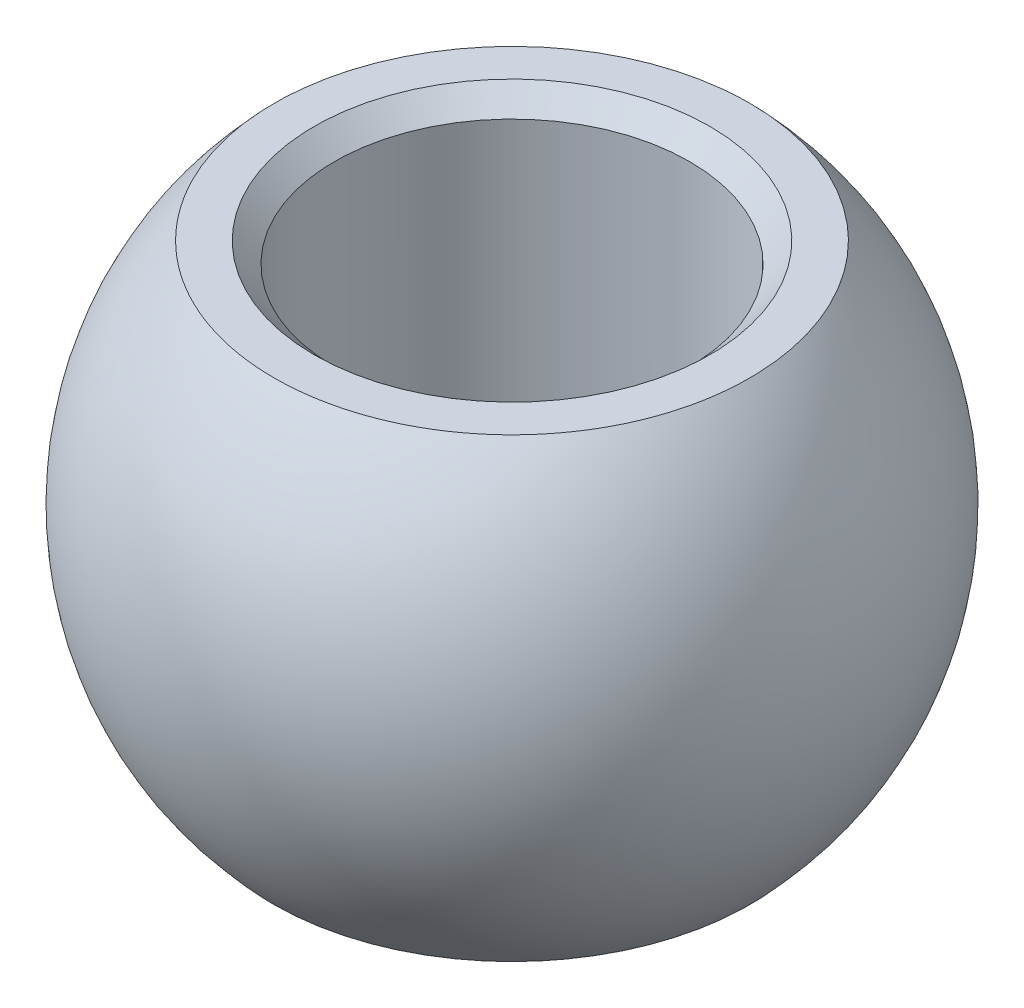
ISO-10303-21;
HEADER;
FILE_DESCRIPTION(('STEP AP214'),'2;1');
FILE_NAME('part.step','',(''),(''),'','','');
FILE_SCHEMA(('AUTOMOTIVE_DESIGN { 1 0 10303 214 1 1 1 1 }'));
ENDSEC;
DATA;
#1=APPLICATION_CONTEXT('core data for automotive mechanical design processes');
#2=APPLICATION_PROTOCOL_DEFINITION('international standard','automotive_design',2000,#1);
#3=PRODUCT_CONTEXT('',#1,'mechanical');
#4=PRODUCT('Part','Part','',(#3));
#5=PRODUCT_RELATED_PRODUCT_CATEGORY('part','',(#4));
#6=PRODUCT_DEFINITION_FORMATION('','',#4);
#7=PRODUCT_DEFINITION_CONTEXT('part definition',#1,'design');
#8=PRODUCT_DEFINITION('design','',#6,#7);
#9=PRODUCT_DEFINITION_SHAPE('','',#8);
#10=(LENGTH_UNIT() NAMED_UNIT(*) SI_UNIT(.MILLI.,.METRE.));
#11=(NAMED_UNIT(*) PLANE_ANGLE_UNIT() SI_UNIT($,.RADIAN.));
#12=(NAMED_UNIT(*) SI_UNIT($,.STERADIAN.) SOLID_ANGLE_UNIT());
#13=UNCERTAINTY_MEASURE_WITH_UNIT(LENGTH_MEASURE(1.E-05),#10,'distance_accuracy_value','');
#14=(GEOMETRIC_REPRESENTATION_CONTEXT(3) GLOBAL_UNCERTAINTY_ASSIGNED_CONTEXT((#13)) GLOBAL_UNIT_ASSIGNED_CONTEXT((#10,
#11,#12)) REPRESENTATION_CONTEXT('',''));
#15=CARTESIAN_POINT('',(0.,0.,0.));
#16=DIRECTION('',(0.,0.,1.));
#17=DIRECTION('',(1.,0.,0.));
#18=AXIS2_PLACEMENT_3D('',#15,#16,#17);
#19=CARTESIAN_POINT('',(0.,0.,61.9252));
#20=DIRECTION('',(0.,1.,0.));
#21=DIRECTION('',(0.,0.,1.));
#22=AXIS2_PLACEMENT_3D('',#19,#20,#21);
#23=CYLINDRICAL_SURFACE('',#22,5.55625);
#24=CARTESIAN_POINT('',(0.,-6.50239999993119,61.9252));
#25=DIRECTION('',(0.,-1.,0.));
#26=DIRECTION('',(0.,0.,-1.));
#27=AXIS2_PLACEMENT_3D('',#24,#25,#26);
#28=CIRCLE('',#27,5.55625000002179);
#29=CARTESIAN_POINT('',(0.,-6.50239999993119,56.3689499999782));
#30=VERTEX_POINT('',#29);
#31=EDGE_CURVE('E34',#30,#30,#28,.T.);
#32=ORIENTED_EDGE('',*,*,#31,.T.);
#33=EDGE_LOOP('',(#32));
#34=FACE_BOUND('',#33,.T.);
#35=CARTESIAN_POINT('',(0.,6.50239999993119,61.9252));
#36=DIRECTION('',(0.,1.,0.));
#37=DIRECTION('',(0.,0.,-1.));
#38=AXIS2_PLACEMENT_3D('',#35,#36,#37);
#39=CIRCLE('',#38,5.55625000002179);
#40=CARTESIAN_POINT('',(0.,6.50239999993119,56.3689499999782));
#41=VERTEX_POINT('',#40);
#42=EDGE_CURVE('E72',#41,#41,#39,.T.);
#43=ORIENTED_EDGE('',*,*,#42,.T.);
#44=EDGE_LOOP('',(#43));
#45=FACE_BOUND('',#44,.T.);
#46=ADVANCED_FACE('F14',(#34,#45),#23,.F.);
#47=CARTESIAN_POINT('',(0.,-7.13739999986274,61.9252));
#48=DIRECTION('',(0.,-1.,0.));
#49=DIRECTION('',(1.,0.,0.));
#50=AXIS2_PLACEMENT_3D('',#47,#48,#49);
#51=CONICAL_SURFACE('',#50,6.19124999989649,0.785398163397448);
#52=ORIENTED_EDGE('',*,*,#31,.F.);
#53=EDGE_LOOP('',(#52));
#54=FACE_BOUND('',#53,.T.);
#55=CARTESIAN_POINT('',(0.,-7.13739999991958,61.9252));
#56=DIRECTION('',(0.,-1.,0.));
#57=DIRECTION('',(1.,0.,0.));
#58=AXIS2_PLACEMENT_3D('',#55,#56,#57);
#59=CIRCLE('',#58,6.19124999995334);
#60=CARTESIAN_POINT('',(6.19124999995334,-7.13739999991958,61.9252));
#61=VERTEX_POINT('',#60);
#62=EDGE_CURVE('E20',#61,#61,#59,.T.);
#63=ORIENTED_EDGE('',*,*,#62,.T.);
#64=EDGE_LOOP('',(#63));
#65=FACE_BOUND('',#64,.T.);
#66=ADVANCED_FACE('F51',(#54,#65),#51,.F.);
#67=CARTESIAN_POINT('',(0.,7.13739999986274,61.9252));
#68=DIRECTION('',(0.,1.,0.));
#69=DIRECTION('',(0.,0.,1.));
#70=AXIS2_PLACEMENT_3D('',#67,#68,#69);
#71=CONICAL_SURFACE('',#70,6.19124999989649,0.785398163397448);
#72=ORIENTED_EDGE('',*,*,#42,.F.);
#73=EDGE_LOOP('',(#72));
#74=FACE_BOUND('',#73,.T.);
#75=CARTESIAN_POINT('',(0.,7.13739999991958,61.9252));
#76=DIRECTION('',(0.,1.,0.));
#77=DIRECTION('',(0.,0.,1.));
#78=AXIS2_PLACEMENT_3D('',#75,#76,#77);
#79=CIRCLE('',#78,6.19124999995334);
#80=CARTESIAN_POINT('',(0.,7.13739999991958,68.1164499999533));
#81=VERTEX_POINT('',#80);
#82=EDGE_CURVE('E29',#81,#81,#79,.T.);
#83=ORIENTED_EDGE('',*,*,#82,.T.);
#84=EDGE_LOOP('',(#83));
#85=FACE_BOUND('',#84,.T.);
#86=ADVANCED_FACE('F47',(#74,#85),#71,.F.);
#87=CARTESIAN_POINT('',(0.,-7.1374,61.9252));
#88=DIRECTION('',(0.,1.,0.));
#89=DIRECTION('',(0.,0.,1.));
#90=AXIS2_PLACEMENT_3D('',#87,#88,#89);
#91=PLANE('',#90);
#92=CARTESIAN_POINT('',(0.,-7.1374,69.368526877143));
#93=CARTESIAN_POINT('',(0.209122739253839,-7.1374,69.3685283780649));
#94=CARTESIAN_POINT('',(0.418220852599612,-7.1374,69.3597101963158));
#95=CARTESIAN_POINT('',(0.835000656901919,-7.1374,69.3244990193713));
#96=CARTESIAN_POINT('',(1.04268196070642,-7.1374,69.298101400655));
#97=CARTESIAN_POINT('',(1.45526472713055,-7.1374,69.2278811222578));
#98=CARTESIAN_POINT('',(1.66016354577062,-7.1374,69.1840429453168));
#99=CARTESIAN_POINT('',(2.06561280096337,-7.1374,69.0792349984351));
#100=CARTESIAN_POINT('',(2.26616161974078,-7.13739999999999,69.0182589686894));
#101=CARTESIAN_POINT('',(2.66123701657341,-7.13739999999999,68.8796747190864));
#102=CARTESIAN_POINT('',(2.85576854014373,-7.1374,68.8020805967283));
#103=CARTESIAN_POINT('',(3.23767444667339,-7.1374,68.6307496929814));
#104=CARTESIAN_POINT('',(3.42504616445478,-7.1374,68.5370069705722));
#105=CARTESIAN_POINT('',(3.79114275050494,-7.1374,68.3341102735748));
#106=CARTESIAN_POINT('',(3.96987139469037,-7.1374,68.2249631119289));
#107=CARTESIAN_POINT('',(4.31750265674955,-7.1374,67.9920003289327));
#108=CARTESIAN_POINT('',(4.48640512247445,-7.13739999999999,67.8681844805419));
#109=CARTESIAN_POINT('',(4.81319441998464,-7.13739999999999,67.6067545791463));
#110=CARTESIAN_POINT('',(4.97108031067617,-7.1374,67.4691393497671));
#111=CARTESIAN_POINT('',(5.27470181314894,-7.1374,67.1810943837631));
#112=CARTESIAN_POINT('',(5.42043713895087,-7.1374,67.0306643456936));
#113=CARTESIAN_POINT('',(5.69869699928873,-7.1374,66.718084810441));
#114=CARTESIAN_POINT('',(5.83122345337967,-7.1374,66.5559370220438));
#115=CARTESIAN_POINT('',(6.08219130069356,-7.1374,66.2209969584441));
#116=CARTESIAN_POINT('',(6.20062780102495,-7.1374,66.0482010169901));
#117=CARTESIAN_POINT('',(6.42247830360987,-7.1374,65.6933112162302));
#118=CARTESIAN_POINT('',(6.5258979413687,-7.1374,65.5112208797635));
#119=CARTESIAN_POINT('',(6.71706815888448,-7.1374,65.1389077086514));
#120=CARTESIAN_POINT('',(6.804812939462,-7.1374,64.9486818962746));
#121=CARTESIAN_POINT('',(6.96394696075429,-7.1374,64.5615512118508));
#122=CARTESIAN_POINT('',(7.03533937644247,-7.1374,64.3646476448939));
#123=CARTESIAN_POINT('',(7.16128395849873,-7.1374,63.9655230960196));
#124=CARTESIAN_POINT('',(7.2158358628712,-7.1374,63.7633020314284));
#125=CARTESIAN_POINT('',(7.30770926145876,-7.1374,63.3549867398679));
#126=CARTESIAN_POINT('',(7.34503105831934,-7.1374,63.1488925809955));
#127=CARTESIAN_POINT('',(7.40218099595225,-7.1374,62.7342879352277));
#128=CARTESIAN_POINT('',(7.42200872744656,-7.1374,62.5257773919161));
#129=CARTESIAN_POINT('',(7.4440260311025,-7.1374,62.1078662222422));
#130=CARTESIAN_POINT('',(7.44621889358321,-7.1374,61.8984657692149));
#131=CARTESIAN_POINT('',(7.43295720234929,-7.1374,61.4801517453058));
#132=CARTESIAN_POINT('',(7.41749653831505,-7.1374,61.2712383680989));
#133=CARTESIAN_POINT('',(7.3690365010343,-7.1374,60.8555315434627));
#134=CARTESIAN_POINT('',(7.33604339495872,-7.1374,60.6487373654084));
#135=CARTESIAN_POINT('',(7.25274141709033,-7.1374,60.238586915631));
#136=CARTESIAN_POINT('',(7.20242615660662,-7.1374,60.0352319414137));
#137=CARTESIAN_POINT('',(7.08485157972004,-7.1374,59.633523060902));
#138=CARTESIAN_POINT('',(7.01759550583887,-7.1374,59.4351682055534));
#139=CARTESIAN_POINT('',(6.86661151984081,-7.1374,59.0448262908173));
#140=CARTESIAN_POINT('',(6.78288335148269,-7.13740000000001,58.8528393305436));
#141=CARTESIAN_POINT('',(6.59955283994053,-7.13740000000001,58.4766050966502));
#142=CARTESIAN_POINT('',(6.49995081111706,-7.1374,58.2923576698507));
#143=CARTESIAN_POINT('',(6.28557730517904,-7.1374,57.9329042469257));
#144=CARTESIAN_POINT('',(6.17080547324815,-7.1374,57.7576984624144));
#145=CARTESIAN_POINT('',(5.92693148140618,-7.1374,57.4176095739012));
#146=CARTESIAN_POINT('',(5.79783197919536,-7.1374,57.2527245643004));
#147=CARTESIAN_POINT('',(5.5261605928008,-7.1374,56.9343606709754));
#148=CARTESIAN_POINT('',(5.38358405954723,-7.13740000000001,56.7808857561624));
#149=CARTESIAN_POINT('',(5.08604553951807,-7.13740000000001,56.4865413117663));
#150=CARTESIAN_POINT('',(4.93108799828014,-7.1374,56.3456672958577));
#151=CARTESIAN_POINT('',(4.60985257138509,-7.1374,56.0774446135473));
#152=CARTESIAN_POINT('',(4.44357052717066,-7.1374,55.9501009601601));
#153=CARTESIAN_POINT('',(3.92958368140964,-7.13740000000001,55.5898955323625));
#154=CARTESIAN_POINT('',(3.56641448794115,-7.13740000000002,55.3785396655555));
#155=CARTESIAN_POINT('',(2.80993865198825,-7.13740000000002,55.0199243906894));
#156=CARTESIAN_POINT('',(2.4166320107942,-7.1374,54.8726649798859));
#157=CARTESIAN_POINT('',(1.6108306225348,-7.1374,54.6462310956424));
#158=CARTESIAN_POINT('',(1.19833587633387,-7.13740000000001,54.5670566191352));
#159=CARTESIAN_POINT('',(0.365908515599231,-7.13740000000001,54.4791007632127));
#160=CARTESIAN_POINT('',(-0.0540240989344792,-7.1374,54.4703193837973));
#161=CARTESIAN_POINT('',(-0.889354048369798,-7.1374,54.5233482139819));
#162=CARTESIAN_POINT('',(-1.30475138306709,-7.13740000000001,54.585158426762));
#163=CARTESIAN_POINT('',(-2.11946966345171,-7.13740000000001,54.7777583472061));
#164=CARTESIAN_POINT('',(-2.51879060845072,-7.1374,54.9085480578235));
#165=CARTESIAN_POINT('',(-3.0967069491697,-7.1374,55.153380921141));
#166=CARTESIAN_POINT('',(-3.28593071572193,-7.1374,55.2431611553682));
#167=CARTESIAN_POINT('',(-3.6561285160143,-7.1374,55.4383256896898));
#168=CARTESIAN_POINT('',(-3.83710556880846,-7.1374,55.5437042183693));
#169=CARTESIAN_POINT('',(-4.18958894640044,-7.1374,55.7693661145088));
#170=CARTESIAN_POINT('',(-4.36109186142807,-7.1374,55.8896547983013));
#171=CARTESIAN_POINT('',(-4.69329914967475,-7.1374,56.1442117239473));
#172=CARTESIAN_POINT('',(-4.85400723983645,-7.1374,56.2784751129211));
#173=CARTESIAN_POINT('',(-5.16357128337301,-7.1374,56.5600866874992));
#174=CARTESIAN_POINT('',(-5.312425035988,-7.1374,56.7074372920566));
#175=CARTESIAN_POINT('',(-5.59718703773549,-7.1374,57.0141511092566));
#176=CARTESIAN_POINT('',(-5.73309558962382,-7.13739999999999,57.1735140408048));
#177=CARTESIAN_POINT('',(-5.99100712953332,-7.1374,57.503125801513));
#178=CARTESIAN_POINT('',(-6.11300984214887,-7.13740000000001,57.6733748461687));
#179=CARTESIAN_POINT('',(-6.34223751518631,-7.13739999999999,58.0235428748943));
#180=CARTESIAN_POINT('',(-6.44946270547718,-7.13739999999997,58.203461708487));
#181=CARTESIAN_POINT('',(-6.64839431551516,-7.13740000000003,58.571727944164));
#182=CARTESIAN_POINT('',(-6.74009776268636,-7.13740000000012,58.7600769520014));
#183=CARTESIAN_POINT('',(-6.90727780088176,-7.13739999999988,59.1437609962336));
#184=CARTESIAN_POINT('',(-6.98276036835317,-7.13739999999956,59.3390934285985));
#185=CARTESIAN_POINT('',(-7.11702908720079,-7.13739999999956,59.7354927858146));
#186=CARTESIAN_POINT('',(-7.17580926249355,-7.13739999999988,59.9365617349364));
#187=CARTESIAN_POINT('',(-7.27620177701077,-7.13740000000012,60.3428668396081));
#188=CARTESIAN_POINT('',(-7.3178200511485,-7.13740000000003,60.5481015287611));
#189=CARTESIAN_POINT('',(-7.38362842070894,-7.13739999999997,60.9613856512413));
#190=CARTESIAN_POINT('',(-7.40781526224514,-7.13739999999999,61.169435602707));
#191=CARTESIAN_POINT('',(-7.43857577628721,-7.13740000000001,61.5868286050915));
#192=CARTESIAN_POINT('',(-7.44514986082375,-7.1374,61.7961716256457));
#193=CARTESIAN_POINT('',(-7.44063927356728,-7.1374,62.2146710322076));
#194=CARTESIAN_POINT('',(-7.42955429158034,-7.1374,62.4238274148724));
#195=CARTESIAN_POINT('',(-7.3898041139643,-7.1374,62.8404595867495));
#196=CARTESIAN_POINT('',(-7.36113919182337,-7.1374,63.0479354020552));
#197=CARTESIAN_POINT('',(-7.28642587118475,-7.1374,63.4597748407619));
#198=CARTESIAN_POINT('',(-7.24037409507299,-7.1374,63.6641378514316));
#199=CARTESIAN_POINT('',(-7.13123529223209,-7.1374,64.0681822439963));
#200=CARTESIAN_POINT('',(-7.06815455894066,-7.1374,64.2678653258939));
#201=CARTESIAN_POINT('',(-6.92537164390296,-7.1374,64.6612829860897));
#202=CARTESIAN_POINT('',(-6.84566321485649,-7.1374,64.8550152971085));
#203=CARTESIAN_POINT('',(-6.67023662783136,-7.1374,65.2350090064699));
#204=CARTESIAN_POINT('',(-6.57452402090966,-7.1374,65.4212729675367));
#205=CARTESIAN_POINT('',(-6.36773495346782,-7.1374,65.7851036937274));
#206=CARTESIAN_POINT('',(-6.25665625866086,-7.1374,65.9626691889684));
#207=CARTESIAN_POINT('',(-6.0199381006157,-7.1374,66.3078074697426));
#208=CARTESIAN_POINT('',(-5.89429898004082,-7.1374,66.475380490297));
#209=CARTESIAN_POINT('',(-5.62936232937669,-7.1374,66.7993332792119));
#210=CARTESIAN_POINT('',(-5.49006596545077,-7.1374,66.9557140012901));
#211=CARTESIAN_POINT('',(-5.19879823116734,-7.1374,67.2561840656686));
#212=CARTESIAN_POINT('',(-5.04682705704817,-7.1374,67.400273598198));
#213=CARTESIAN_POINT('',(-4.73121822882861,-7.1374,67.675200583996));
#214=CARTESIAN_POINT('',(-4.56757545835214,-7.1374,67.8060321638986));
#215=CARTESIAN_POINT('',(-4.22990946431958,-7.1374,68.0533944013056));
#216=CARTESIAN_POINT('',(-4.05589008870511,-7.1374,68.1699303116417));
#217=CARTESIAN_POINT('',(-3.69850167666436,-7.1374,68.3880213164068));
#218=CARTESIAN_POINT('',(-3.51512485768758,-7.1374,68.4895636582082));
#219=CARTESIAN_POINT('',(-3.14053273868573,-7.1374,68.6767922581806));
#220=CARTESIAN_POINT('',(-2.94932032895168,-7.1374,68.7624842998258));
#221=CARTESIAN_POINT('',(-2.56052372791361,-7.1374,68.9173798442084));
#222=CARTESIAN_POINT('',(-2.36294536516441,-7.1374,68.986597968982));
#223=CARTESIAN_POINT('',(-1.96272783574675,-7.1374,69.1081346358892));
#224=CARTESIAN_POINT('',(-1.76009001395321,-7.1374,69.1604576185345));
#225=CARTESIAN_POINT('',(-1.30018767194763,-7.1374,69.2587397803458));
#226=CARTESIAN_POINT('',(-1.04187813245729,-7.1374,69.2998750032351));
#227=CARTESIAN_POINT('',(-0.522366259475799,-7.1374,69.354767614417));
#228=CARTESIAN_POINT('',(-0.261163925984641,-7.1374,69.3685250027097));
#229=CARTESIAN_POINT('',(0.,-7.1374,69.368526877143));
#230=B_SPLINE_CURVE_WITH_KNOTS('',3,(#92,#93,#94,#95,#96,#97,#98,#99,#100,#101,#102,#103,#104,
#105,#106,#107,#108,#109,#110,#111,#112,#113,#114,#115,#116,#117,#118,#119,#120,#121,#122,#123,
#124,#125,#126,#127,#128,#129,#130,#131,#132,#133,#134,#135,#136,#137,#138,#139,#140,#141,#142,
#143,#144,#145,#146,#147,#148,#149,#150,#151,#152,#153,#154,#155,#156,#157,#158,#159,#160,#161,
#162,#163,#164,#165,#166,#167,#168,#169,#170,#171,#172,#173,#174,#175,#176,#177,#178,#179,#180,
#181,#182,#183,#184,#185,#186,#187,#188,#189,#190,#191,#192,#193,#194,#195,#196,#197,#198,#199,
#200,#201,#202,#203,#204,#205,#206,#207,#208,#209,#210,#211,#212,#213,#214,#215,#216,#217,#218,
#219,#220,#221,#222,#223,#224,#225,#226,#227,#228,#229),.UNSPECIFIED.,.T.,.F.,(4,2,2,2,2,2,2,2,
2,2,2,2,2,2,2,2,2,2,2,2,2,2,2,2,2,2,2,2,2,2,2,2,2,2,2,2,2,2,2,2,2,2,2,2,2,2,2,2,2,2,2,2,2,2,2,2,
2,2,2,2,2,2,2,2,2,2,2,2,4),(0.,0.627140096217695,1.25444520005672,1.88230968415323,
2.5104038019489,3.13796718921589,3.76576195013314,4.39327992045434,5.02080760469901,
5.6483888301938,6.27598482245988,6.90348947710312,7.53121140748014,8.15869715509571,
8.7864145730886,9.41401001002642,10.0416152102648,10.6692093862478,11.2968182445636,
11.9243100007151,12.5520190130468,13.1795037944368,13.8072202507355,14.4348166514272,
15.0624228158315,15.6900165528798,16.317624971723,16.9451171667901,17.5728266186135,
18.2003116886446,18.8280284378217,20.0821144584024,21.3362004252879,22.5902863356757,
23.8443722460635,25.0984582129491,26.3525442335297,26.9802609827068,27.607746052738,
28.2354555045614,28.8629476996285,29.4905561184717,30.11814985552,30.7457560199242,
31.3733524206159,32.0010688769146,32.6285536583045,33.2562626706362,33.8837544267878,
34.5113632851036,35.1389574610867,35.7665626613251,36.3941580982629,37.0218755162558,
37.6493612638713,38.2770831942484,38.9045878488916,39.5321838411577,40.1597650666525,
40.7872927508971,41.4148107212183,42.0426054821356,42.6701688694026,43.2982629871982,
43.9261274712948,44.5534325751338,45.1805726713515,45.9637795586321,46.7469864459128),.UNSPECIFIED.);
#231=CARTESIAN_POINT('',(0.,-7.1374,69.368526877143));
#232=VERTEX_POINT('',#231);
#233=EDGE_CURVE('E24',#232,#232,#230,.T.);
#234=ORIENTED_EDGE('',*,*,#233,.F.);
#235=EDGE_LOOP('',(#234));
#236=FACE_BOUND('',#235,.T.);
#237=ORIENTED_EDGE('',*,*,#62,.F.);
#238=EDGE_LOOP('',(#237));
#239=FACE_BOUND('',#238,.T.);
#240=ADVANCED_FACE('F42',(#236,#239),#91,.F.);
#241=CARTESIAN_POINT('',(0.,7.1374,61.9252));
#242=DIRECTION('',(0.,-1.,0.));
#243=DIRECTION('',(0.,0.,-1.));
#244=AXIS2_PLACEMENT_3D('',#241,#242,#243);
#245=PLANE('',#244);
#246=CARTESIAN_POINT('',(0.,7.1374,54.481873122857));
#247=CARTESIAN_POINT('',(0.209122739253835,7.1374,54.4818716219351));
#248=CARTESIAN_POINT('',(0.418220852599609,7.1374,54.4906898036842));
#249=CARTESIAN_POINT('',(0.835000656901915,7.1374,54.5259009806287));
#250=CARTESIAN_POINT('',(1.04268196070642,7.1374,54.552298599345));
#251=CARTESIAN_POINT('',(1.45526472713055,7.1374,54.6225188777422));
#252=CARTESIAN_POINT('',(1.66016354577063,7.1374,54.6663570546832));
#253=CARTESIAN_POINT('',(2.06561280096338,7.1374,54.7711650015649));
#254=CARTESIAN_POINT('',(2.26616161974078,7.1374,54.8321410313106));
#255=CARTESIAN_POINT('',(2.66123701657341,7.1374,54.9707252809136));
#256=CARTESIAN_POINT('',(2.85576854014374,7.1374,55.0483194032716));
#257=CARTESIAN_POINT('',(3.2376744466734,7.1374,55.2196503070186));
#258=CARTESIAN_POINT('',(3.42504616445479,7.1374,55.3133930294278));
#259=CARTESIAN_POINT('',(3.79114275050495,7.1374,55.5162897264252));
#260=CARTESIAN_POINT('',(3.96987139469037,7.1374,55.6254368880711));
#261=CARTESIAN_POINT('',(4.31750265674955,7.1374,55.8583996710673));
#262=CARTESIAN_POINT('',(4.48640512247445,7.1374,55.9822155194581));
#263=CARTESIAN_POINT('',(4.81319441998464,7.1374,56.2436454208537));
#264=CARTESIAN_POINT('',(4.97108031067617,7.1374,56.3812606502329));
#265=CARTESIAN_POINT('',(5.27470181314894,7.1374,56.6693056162369));
#266=CARTESIAN_POINT('',(5.42043713895086,7.1374,56.8197356543064));
#267=CARTESIAN_POINT('',(5.69869699928873,7.1374,57.132315189559));
#268=CARTESIAN_POINT('',(5.83122345337967,7.1374,57.2944629779562));
#269=CARTESIAN_POINT('',(6.08219130069357,7.1374,57.6294030415559));
#270=CARTESIAN_POINT('',(6.20062780102496,7.13739999999999,57.8021989830099));
#271=CARTESIAN_POINT('',(6.42247830360988,7.13739999999999,58.1570887837698));
#272=CARTESIAN_POINT('',(6.52589794136871,7.1374,58.3391791202365));
#273=CARTESIAN_POINT('',(6.71706815888449,7.1374,58.7114922913486));
#274=CARTESIAN_POINT('',(6.80481293946201,7.1374,58.9017181037254));
#275=CARTESIAN_POINT('',(6.9639469607543,7.1374,59.2888487881492));
#276=CARTESIAN_POINT('',(7.03533937644246,7.1374,59.4857523551061));
#277=CARTESIAN_POINT('',(7.16128395849873,7.1374,59.8848769039804));
#278=CARTESIAN_POINT('',(7.2158358628712,7.13739999999999,60.0870979685716));
#279=CARTESIAN_POINT('',(7.30770926145876,7.13739999999999,60.4954132601321));
#280=CARTESIAN_POINT('',(7.34503105831933,7.1374,60.7015074190045));
#281=CARTESIAN_POINT('',(7.40218099595225,7.1374,61.1161120647723));
#282=CARTESIAN_POINT('',(7.42200872744657,7.1374,61.3246226080839));
#283=CARTESIAN_POINT('',(7.44402603110251,7.1374,61.7425337777578));
#284=CARTESIAN_POINT('',(7.44621889358321,7.1374,61.9519342307851));
#285=CARTESIAN_POINT('',(7.43295720234928,7.1374,62.3702482546942));
#286=CARTESIAN_POINT('',(7.41749653831505,7.1374,62.5791616319011));
#287=CARTESIAN_POINT('',(7.3690365010343,7.1374,62.9948684565374));
#288=CARTESIAN_POINT('',(7.33604339495873,7.1374,63.2016626345916));
#289=CARTESIAN_POINT('',(7.25274141709034,7.1374,63.611813084369));
#290=CARTESIAN_POINT('',(7.20242615660662,7.1374,63.8151680585863));
#291=CARTESIAN_POINT('',(7.08485157972004,7.1374,64.2168769390979));
#292=CARTESIAN_POINT('',(7.01759550583887,7.1374,64.4152317944465));
#293=CARTESIAN_POINT('',(6.86661151984081,7.1374,64.8055737091827));
#294=CARTESIAN_POINT('',(6.78288335148269,7.1374,64.9975606694563));
#295=CARTESIAN_POINT('',(6.59955283994054,7.1374,65.3737949033498));
#296=CARTESIAN_POINT('',(6.49995081111707,7.1374,65.5580423301493));
#297=CARTESIAN_POINT('',(6.28557730517904,7.1374,65.9174957530743));
#298=CARTESIAN_POINT('',(6.17080547324815,7.1374,66.0927015375856));
#299=CARTESIAN_POINT('',(5.92693148140617,7.1374,66.4327904260988));
#300=CARTESIAN_POINT('',(5.79783197919534,7.1374,66.5976754356996));
#301=CARTESIAN_POINT('',(5.52616059280079,7.1374,66.9160393290246));
#302=CARTESIAN_POINT('',(5.38358405954723,7.1374,67.0695142438376));
#303=CARTESIAN_POINT('',(5.08604553951807,7.1374,67.3638586882337));
#304=CARTESIAN_POINT('',(4.93108799828014,7.1374,67.5047327041423));
#305=CARTESIAN_POINT('',(4.60985257138509,7.1374,67.7729553864527));
#306=CARTESIAN_POINT('',(4.44357052717067,7.1374,67.9002990398399));
#307=CARTESIAN_POINT('',(3.92958368140963,7.1374,68.2605044676375));
#308=CARTESIAN_POINT('',(3.56641448794114,7.13739999999998,68.4718603344445));
#309=CARTESIAN_POINT('',(2.80993865198824,7.13739999999998,68.8304756093106));
#310=CARTESIAN_POINT('',(2.4166320107942,7.13739999999999,68.9777350201142));
#311=CARTESIAN_POINT('',(1.6108306225348,7.13740000000001,69.2041689043576));
#312=CARTESIAN_POINT('',(1.19833587633388,7.13740000000001,69.2833433808647));
#313=CARTESIAN_POINT('',(0.365908515599245,7.1374,69.3712992367873));
#314=CARTESIAN_POINT('',(-0.0540240989344658,7.1374,69.3800806162027));
#315=CARTESIAN_POINT('',(-0.889354048369783,7.1374,69.3270517860182));
#316=CARTESIAN_POINT('',(-1.30475138306707,7.1374,69.265241573238));
#317=CARTESIAN_POINT('',(-2.11946966345169,7.1374,69.0726416527939));
#318=CARTESIAN_POINT('',(-2.5187906084507,7.1374,68.9418519421765));
#319=CARTESIAN_POINT('',(-3.09670694916969,7.1374,68.697019078859));
#320=CARTESIAN_POINT('',(-3.28593071572192,7.1374,68.6072388446318));
#321=CARTESIAN_POINT('',(-3.6561285160143,7.1374,68.4120743103103));
#322=CARTESIAN_POINT('',(-3.83710556880847,7.1374,68.3066957816307));
#323=CARTESIAN_POINT('',(-4.18958894640045,7.1374,68.0810338854912));
#324=CARTESIAN_POINT('',(-4.36109186142807,7.1374,67.9607452016987));
#325=CARTESIAN_POINT('',(-4.69329914967475,7.1374,67.7061882760527));
#326=CARTESIAN_POINT('',(-4.85400723983645,7.1374,67.5719248870789));
#327=CARTESIAN_POINT('',(-5.16357128337301,7.1374,67.2903133125008));
#328=CARTESIAN_POINT('',(-5.312425035988,7.13740000000001,67.1429627079434));
#329=CARTESIAN_POINT('',(-5.5971870377355,7.13739999999999,66.8362488907434));
#330=CARTESIAN_POINT('',(-5.73309558962383,7.13739999999997,66.6768859591952));
#331=CARTESIAN_POINT('',(-5.99100712953333,7.13739999999997,66.347274198487));
#332=CARTESIAN_POINT('',(-6.11300984214887,7.13739999999999,66.1770251538312));
#333=CARTESIAN_POINT('',(-6.34223751518631,7.13740000000001,65.8268571251057));
#334=CARTESIAN_POINT('',(-6.44946270547717,7.1374,65.646938291513));
#335=CARTESIAN_POINT('',(-6.6483943155152,7.1374,65.278672055836));
#336=CARTESIAN_POINT('',(-6.74009776268643,7.1374,65.0903230479985));
#337=CARTESIAN_POINT('',(-6.90727780088174,7.1374,64.7066390037663));
#338=CARTESIAN_POINT('',(-6.98276036835301,7.1374,64.5113065714014));
#339=CARTESIAN_POINT('',(-7.11702908720063,7.1374,64.1149072141852));
#340=CARTESIAN_POINT('',(-7.17580926249352,7.1374,63.9138382650635));
#341=CARTESIAN_POINT('',(-7.27620177701084,7.1374,63.5075331603918));
#342=CARTESIAN_POINT('',(-7.31782005114854,7.1374,63.3022984712388));
#343=CARTESIAN_POINT('',(-7.38362842070893,7.1374,62.8890143487586));
#344=CARTESIAN_POINT('',(-7.40781526224514,7.1374,62.680964397293));
#345=CARTESIAN_POINT('',(-7.43857577628721,7.1374,62.2635713949085));
#346=CARTESIAN_POINT('',(-7.44514986082375,7.13740000000001,62.0542283743543));
#347=CARTESIAN_POINT('',(-7.44063927356729,7.13740000000001,61.6357289677924));
#348=CARTESIAN_POINT('',(-7.42955429158034,7.1374,61.4265725851276));
#349=CARTESIAN_POINT('',(-7.3898041139643,7.1374,61.0099404132505));
#350=CARTESIAN_POINT('',(-7.36113919182337,7.1374,60.8024645979448));
#351=CARTESIAN_POINT('',(-7.28642587118475,7.1374,60.3906251592381));
#352=CARTESIAN_POINT('',(-7.24037409507299,7.1374,60.1862621485684));
#353=CARTESIAN_POINT('',(-7.13123529223209,7.1374,59.7822177560037));
#354=CARTESIAN_POINT('',(-7.06815455894065,7.1374,59.582534674106));
#355=CARTESIAN_POINT('',(-6.92537164390295,7.1374,59.1891170139103));
#356=CARTESIAN_POINT('',(-6.84566321485649,7.1374,58.9953847028915));
#357=CARTESIAN_POINT('',(-6.67023662783135,7.1374,58.61539099353));
#358=CARTESIAN_POINT('',(-6.57452402090964,7.1374,58.4291270324633));
#359=CARTESIAN_POINT('',(-6.36773495346781,7.1374,58.0652963062725));
#360=CARTESIAN_POINT('',(-6.25665625866085,7.1374,57.8877308110316));
#361=CARTESIAN_POINT('',(-6.01993810061569,7.1374,57.5425925302574));
#362=CARTESIAN_POINT('',(-5.89429898004081,7.1374,57.375019509703));
#363=CARTESIAN_POINT('',(-5.62936232937668,7.1374,57.051066720788));
#364=CARTESIAN_POINT('',(-5.49006596545076,7.1374,56.8946859987099));
#365=CARTESIAN_POINT('',(-5.19879823116733,7.1374,56.5942159343314));
#366=CARTESIAN_POINT('',(-5.04682705704815,7.1374,56.450126401802));
#367=CARTESIAN_POINT('',(-4.7312182288286,7.1374,56.175199416004));
#368=CARTESIAN_POINT('',(-4.56757545835213,7.1374,56.0443678361014));
#369=CARTESIAN_POINT('',(-4.22990946431958,7.1374,55.7970055986944));
#370=CARTESIAN_POINT('',(-4.05589008870511,7.1374,55.6804696883584));
#371=CARTESIAN_POINT('',(-3.69850167666435,7.1374,55.4623786835932));
#372=CARTESIAN_POINT('',(-3.51512485768758,7.1374,55.3608363417918));
#373=CARTESIAN_POINT('',(-3.14053273868572,7.1374,55.1736077418194));
#374=CARTESIAN_POINT('',(-2.94932032895168,7.1374,55.0879157001742));
#375=CARTESIAN_POINT('',(-2.56052372791361,7.1374,54.9330201557916));
#376=CARTESIAN_POINT('',(-2.3629453651644,7.1374,54.863802031018));
#377=CARTESIAN_POINT('',(-1.96272783574674,7.1374,54.7422653641108));
#378=CARTESIAN_POINT('',(-1.76009001395321,7.13739999999999,54.6899423814655));
#379=CARTESIAN_POINT('',(-1.30018767194763,7.13739999999999,54.5916602196542));
#380=CARTESIAN_POINT('',(-1.04187813245729,7.1374,54.5505249967649));
#381=CARTESIAN_POINT('',(-0.522366259475799,7.13740000000001,54.495632385583));
#382=CARTESIAN_POINT('',(-0.261163925984643,7.1374,54.4818749972903));
#383=CARTESIAN_POINT('',(0.,7.1374,54.481873122857));
#384=B_SPLINE_CURVE_WITH_KNOTS('',3,(#246,#247,#248,#249,#250,#251,#252,#253,#254,#255,#256,
#257,#258,#259,#260,#261,#262,#263,#264,#265,#266,#267,#268,#269,#270,#271,#272,#273,#274,#275,
#276,#277,#278,#279,#280,#281,#282,#283,#284,#285,#286,#287,#288,#289,#290,#291,#292,#293,#294,
#295,#296,#297,#298,#299,#300,#301,#302,#303,#304,#305,#306,#307,#308,#309,#310,#311,#312,#313,
#314,#315,#316,#317,#318,#319,#320,#321,#322,#323,#324,#325,#326,#327,#328,#329,#330,#331,#332,
#333,#334,#335,#336,#337,#338,#339,#340,#341,#342,#343,#344,#345,#346,#347,#348,#349,#350,#351,
#352,#353,#354,#355,#356,#357,#358,#359,#360,#361,#362,#363,#364,#365,#366,#367,#368,#369,#370,
#371,#372,#373,#374,#375,#376,#377,#378,#379,#380,#381,#382,#383),.UNSPECIFIED.,.T.,.F.,(4,2,2,
2,2,2,2,2,2,2,2,2,2,2,2,2,2,2,2,2,2,2,2,2,2,2,2,2,2,2,2,2,2,2,2,2,2,2,2,2,2,2,2,2,2,2,2,2,2,2,2,
2,2,2,2,2,2,2,2,2,2,2,2,2,2,2,2,2,4),(0.,0.627140096217695,1.25444520005672,1.88230968415323,
2.5104038019489,3.1379671892159,3.76576195013314,4.39327992045435,5.02080760469901,
5.6483888301938,6.27598482245988,6.90348947710312,7.53121140748015,8.15869715509572,
8.78641457308862,9.41401001002643,10.0416152102648,10.6692093862478,11.2968182445636,
11.9243100007152,12.5520190130468,13.1795037944368,13.8072202507355,14.4348166514272,
15.0624228158315,15.6900165528798,16.317624971723,16.9451171667901,17.5728266186135,
18.2003116886446,18.8280284378217,20.0821144584024,21.3362004252879,22.5902863356757,
23.8443722460635,25.0984582129491,26.3525442335297,26.9802609827068,27.607746052738,
28.2354555045614,28.8629476996285,29.4905561184717,30.11814985552,30.7457560199243,
31.373352420616,32.0010688769147,32.6285536583047,33.2562626706363,33.8837544267879,
34.5113632851037,35.1389574610867,35.7665626613251,36.3941580982629,37.0218755162558,
37.6493612638714,38.2770831942484,38.9045878488916,39.5321838411577,40.1597650666525,
40.7872927508972,41.4148107212184,42.0426054821356,42.6701688694026,43.2982629871983,
43.9261274712948,44.5534325751338,45.1805726713515,45.9637795586322,46.7469864459128),.UNSPECIFIED.);
#385=CARTESIAN_POINT('',(0.,7.1374,54.481873122857));
#386=VERTEX_POINT('',#385);
#387=EDGE_CURVE('E10',#386,#386,#384,.T.);
#388=ORIENTED_EDGE('',*,*,#387,.F.);
#389=EDGE_LOOP('',(#388));
#390=FACE_BOUND('',#389,.T.);
#391=ORIENTED_EDGE('',*,*,#82,.F.);
#392=EDGE_LOOP('',(#391));
#393=FACE_BOUND('',#392,.T.);
#394=ADVANCED_FACE('F39',(#390,#393),#245,.F.);
#395=CARTESIAN_POINT('',(0.,0.,61.9252));
#396=DIRECTION('',(0.102530482974115,0.87672339469608,0.469939984736006));
#397=DIRECTION('',(-0.994400962589246,0.102484991768861,0.0257595043375689));
#398=AXIS2_PLACEMENT_3D('',#395,#396,#397);
#399=SPHERICAL_SURFACE('',#398,10.3124);
#400=ORIENTED_EDGE('',*,*,#387,.T.);
#401=EDGE_LOOP('',(#400));
#402=FACE_BOUND('',#401,.T.);
#403=ORIENTED_EDGE('',*,*,#233,.T.);
#404=EDGE_LOOP('',(#403));
#405=FACE_BOUND('',#404,.T.);
#406=ADVANCED_FACE('F16',(#402,#405),#399,.T.);
#407=CLOSED_SHELL('',(#46,#66,#86,#240,#394,#406));
#408=MANIFOLD_SOLID_BREP('B1',#407);
#409=ADVANCED_BREP_SHAPE_REPRESENTATION('',(#18,#408),#14);
#410=SHAPE_DEFINITION_REPRESENTATION(#9,#409);
ENDSEC;
END-ISO-10303-21;
